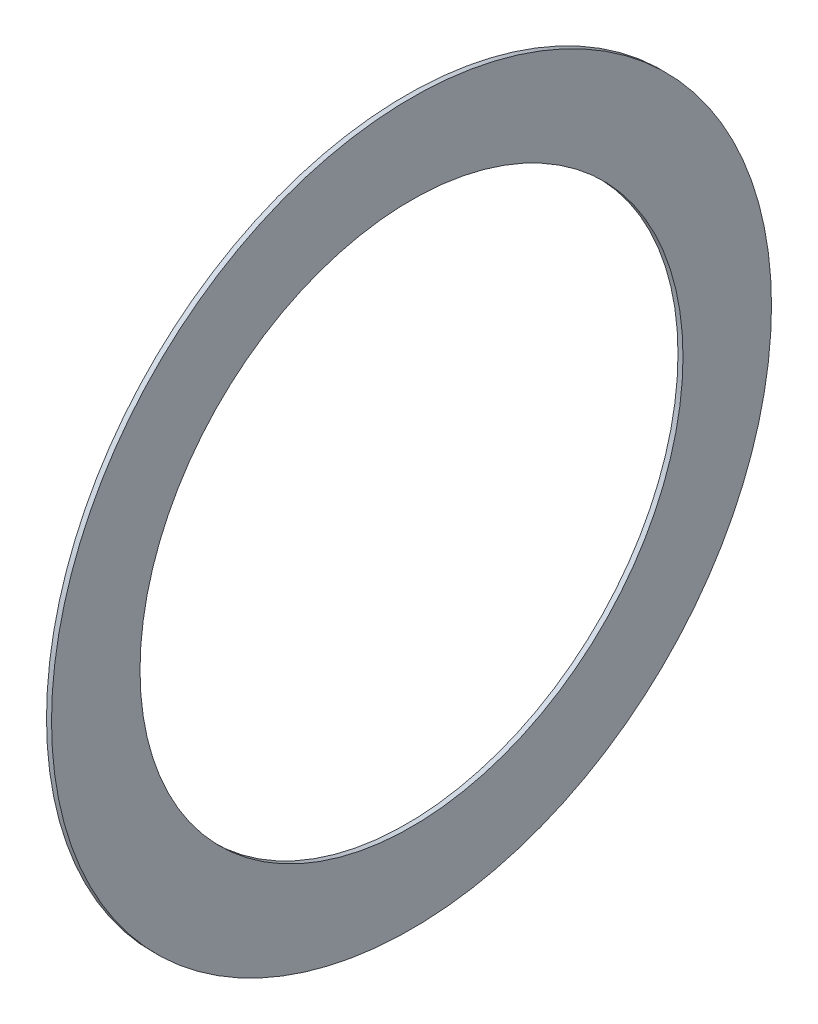
ISO-10303-21;
HEADER;
FILE_DESCRIPTION(('STEP AP214'),'2;1');
FILE_NAME('part.step','',(''),(''),'','','');
FILE_SCHEMA(('AUTOMOTIVE_DESIGN { 1 0 10303 214 1 1 1 1 }'));
ENDSEC;
DATA;
#1=APPLICATION_CONTEXT('core data for automotive mechanical design processes');
#2=APPLICATION_PROTOCOL_DEFINITION('international standard','automotive_design',2000,#1);
#3=PRODUCT_CONTEXT('',#1,'mechanical');
#4=PRODUCT('Part','Part','',(#3));
#5=PRODUCT_RELATED_PRODUCT_CATEGORY('part','',(#4));
#6=PRODUCT_DEFINITION_FORMATION('','',#4);
#7=PRODUCT_DEFINITION_CONTEXT('part definition',#1,'design');
#8=PRODUCT_DEFINITION('design','',#6,#7);
#9=PRODUCT_DEFINITION_SHAPE('','',#8);
#10=(LENGTH_UNIT() NAMED_UNIT(*) SI_UNIT(.MILLI.,.METRE.));
#11=(NAMED_UNIT(*) PLANE_ANGLE_UNIT() SI_UNIT($,.RADIAN.));
#12=(NAMED_UNIT(*) SI_UNIT($,.STERADIAN.) SOLID_ANGLE_UNIT());
#13=UNCERTAINTY_MEASURE_WITH_UNIT(LENGTH_MEASURE(1.E-05),#10,'distance_accuracy_value','');
#14=(GEOMETRIC_REPRESENTATION_CONTEXT(3) GLOBAL_UNCERTAINTY_ASSIGNED_CONTEXT((#13)) GLOBAL_UNIT_ASSIGNED_CONTEXT((#10,
#11,#12)) REPRESENTATION_CONTEXT('',''));
#15=CARTESIAN_POINT('',(0.,0.,0.));
#16=DIRECTION('',(0.,0.,1.));
#17=DIRECTION('',(1.,0.,0.));
#18=AXIS2_PLACEMENT_3D('',#15,#16,#17);
#19=CARTESIAN_POINT('',(0.5,0.,0.));
#20=DIRECTION('',(1.,0.,0.));
#21=DIRECTION('',(0.,0.,-1.));
#22=AXIS2_PLACEMENT_3D('',#19,#20,#21);
#23=PLANE('',#22);
#24=CARTESIAN_POINT('',(0.5,0.,0.));
#25=DIRECTION('',(1.,0.,0.));
#26=DIRECTION('',(0.,0.,-1.));
#27=AXIS2_PLACEMENT_3D('',#24,#25,#26);
#28=CIRCLE('',#27,36.0000000000014);
#29=CARTESIAN_POINT('',(0.5,0.,-36.0000000000014));
#30=VERTEX_POINT('',#29);
#31=EDGE_CURVE('E10',#30,#30,#28,.T.);
#32=ORIENTED_EDGE('',*,*,#31,.T.);
#33=EDGE_LOOP('',(#32));
#34=FACE_BOUND('',#33,.T.);
#35=CARTESIAN_POINT('',(0.5,0.,0.));
#36=DIRECTION('',(1.,0.,0.));
#37=DIRECTION('',(0.,0.,-1.));
#38=AXIS2_PLACEMENT_3D('',#35,#36,#37);
#39=CIRCLE('',#38,27.15);
#40=CARTESIAN_POINT('',(0.5,0.,-27.15));
#41=VERTEX_POINT('',#40);
#42=EDGE_CURVE('E46',#41,#41,#39,.T.);
#43=ORIENTED_EDGE('',*,*,#42,.F.);
#44=EDGE_LOOP('',(#43));
#45=FACE_BOUND('',#44,.T.);
#46=ADVANCED_FACE('F35',(#34,#45),#23,.T.);
#47=CARTESIAN_POINT('',(0.,0.,0.));
#48=DIRECTION('',(1.,0.,0.));
#49=DIRECTION('',(0.,0.,-1.));
#50=AXIS2_PLACEMENT_3D('',#47,#48,#49);
#51=PLANE('',#50);
#52=CARTESIAN_POINT('',(0.,0.,0.));
#53=DIRECTION('',(1.,0.,0.));
#54=DIRECTION('',(0.,0.,-1.));
#55=AXIS2_PLACEMENT_3D('',#52,#53,#54);
#56=CIRCLE('',#55,36.0000000000014);
#57=CARTESIAN_POINT('',(0.,0.,-36.0000000000014));
#58=VERTEX_POINT('',#57);
#59=EDGE_CURVE('E39',#58,#58,#56,.T.);
#60=ORIENTED_EDGE('',*,*,#59,.F.);
#61=EDGE_LOOP('',(#60));
#62=FACE_BOUND('',#61,.T.);
#63=CARTESIAN_POINT('',(0.,0.,0.));
#64=DIRECTION('',(1.,0.,0.));
#65=DIRECTION('',(0.,0.,-1.));
#66=AXIS2_PLACEMENT_3D('',#63,#64,#65);
#67=CIRCLE('',#66,27.15);
#68=CARTESIAN_POINT('',(0.,0.,-27.15));
#69=VERTEX_POINT('',#68);
#70=EDGE_CURVE('E48',#69,#69,#67,.T.);
#71=ORIENTED_EDGE('',*,*,#70,.T.);
#72=EDGE_LOOP('',(#71));
#73=FACE_BOUND('',#72,.T.);
#74=ADVANCED_FACE('F58',(#62,#73),#51,.F.);
#75=CARTESIAN_POINT('',(0.5,0.,0.));
#76=DIRECTION('',(-1.,0.,0.));
#77=DIRECTION('',(0.,0.,1.));
#78=AXIS2_PLACEMENT_3D('',#75,#76,#77);
#79=CYLINDRICAL_SURFACE('',#78,36.0000000000014);
#80=ORIENTED_EDGE('',*,*,#31,.F.);
#81=EDGE_LOOP('',(#80));
#82=FACE_BOUND('',#81,.T.);
#83=ORIENTED_EDGE('',*,*,#59,.T.);
#84=EDGE_LOOP('',(#83));
#85=FACE_BOUND('',#84,.T.);
#86=ADVANCED_FACE('F37',(#82,#85),#79,.T.);
#87=CARTESIAN_POINT('',(0.5,0.,0.));
#88=DIRECTION('',(-1.,0.,0.));
#89=DIRECTION('',(0.,0.,1.));
#90=AXIS2_PLACEMENT_3D('',#87,#88,#89);
#91=CYLINDRICAL_SURFACE('',#90,27.15);
#92=ORIENTED_EDGE('',*,*,#42,.T.);
#93=EDGE_LOOP('',(#92));
#94=FACE_BOUND('',#93,.T.);
#95=ORIENTED_EDGE('',*,*,#70,.F.);
#96=EDGE_LOOP('',(#95));
#97=FACE_BOUND('',#96,.T.);
#98=ADVANCED_FACE('F54',(#94,#97),#91,.F.);
#99=CLOSED_SHELL('',(#46,#74,#86,#98));
#100=MANIFOLD_SOLID_BREP('B2',#99);
#101=ADVANCED_BREP_SHAPE_REPRESENTATION('',(#18,#100),#14);
#102=SHAPE_DEFINITION_REPRESENTATION(#9,#101);
ENDSEC;
END-ISO-10303-21;
